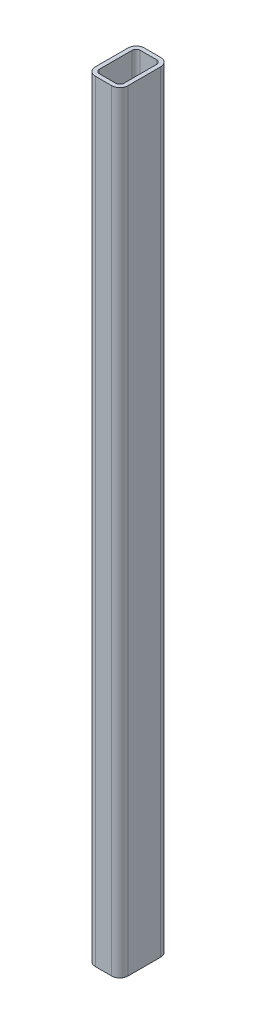
ISO-10303-21;
HEADER;
FILE_DESCRIPTION(('STEP AP214'),'2;1');
FILE_NAME('part.step','',(''),(''),'','','');
FILE_SCHEMA(('AUTOMOTIVE_DESIGN { 1 0 10303 214 1 1 1 1 }'));
ENDSEC;
DATA;
#1=APPLICATION_CONTEXT('core data for automotive mechanical design processes');
#2=APPLICATION_PROTOCOL_DEFINITION('international standard','automotive_design',2000,#1);
#3=PRODUCT_CONTEXT('',#1,'mechanical');
#4=PRODUCT('Part','Part','',(#3));
#5=PRODUCT_RELATED_PRODUCT_CATEGORY('part','',(#4));
#6=PRODUCT_DEFINITION_FORMATION('','',#4);
#7=PRODUCT_DEFINITION_CONTEXT('part definition',#1,'design');
#8=PRODUCT_DEFINITION('design','',#6,#7);
#9=PRODUCT_DEFINITION_SHAPE('','',#8);
#10=(LENGTH_UNIT() NAMED_UNIT(*) SI_UNIT(.MILLI.,.METRE.));
#11=(NAMED_UNIT(*) PLANE_ANGLE_UNIT() SI_UNIT($,.RADIAN.));
#12=(NAMED_UNIT(*) SI_UNIT($,.STERADIAN.) SOLID_ANGLE_UNIT());
#13=UNCERTAINTY_MEASURE_WITH_UNIT(LENGTH_MEASURE(1.E-05),#10,'distance_accuracy_value','');
#14=(GEOMETRIC_REPRESENTATION_CONTEXT(3) GLOBAL_UNCERTAINTY_ASSIGNED_CONTEXT((#13)) GLOBAL_UNIT_ASSIGNED_CONTEXT((#10,
#11,#12)) REPRESENTATION_CONTEXT('',''));
#15=CARTESIAN_POINT('',(0.,0.,0.));
#16=DIRECTION('',(0.,0.,1.));
#17=DIRECTION('',(1.,0.,0.));
#18=AXIS2_PLACEMENT_3D('',#15,#16,#17);
#19=CARTESIAN_POINT('',(-12.699978,1200.,25.4));
#20=DIRECTION('',(0.,-1.,0.));
#21=DIRECTION('',(0.,0.,-1.));
#22=AXIS2_PLACEMENT_3D('',#19,#20,#21);
#23=CYLINDRICAL_SURFACE('',#22,12.7);
#24=CARTESIAN_POINT('',(-12.699978,0.,25.4));
#25=DIRECTION('',(0.,1.,0.));
#26=DIRECTION('',(0.,0.,1.));
#27=AXIS2_PLACEMENT_3D('',#24,#25,#26);
#28=CIRCLE('',#27,12.7);
#29=CARTESIAN_POINT('',(-25.399978,0.,25.4));
#30=VERTEX_POINT('',#29);
#31=CARTESIAN_POINT('',(-12.699978,0.,38.1));
#32=VERTEX_POINT('',#31);
#33=EDGE_CURVE('E234',#30,#32,#28,.T.);
#34=ORIENTED_EDGE('',*,*,#33,.T.);
#35=DIRECTION('',(0.,-1.,0.));
#36=VECTOR('',#35,1.);
#37=CARTESIAN_POINT('',(-12.699978,1200.,38.1));
#38=LINE('',#37,#36);
#39=CARTESIAN_POINT('',(-12.699978,1200.,38.1));
#40=VERTEX_POINT('',#39);
#41=EDGE_CURVE('E12',#40,#32,#38,.T.);
#42=ORIENTED_EDGE('',*,*,#41,.F.);
#43=CARTESIAN_POINT('',(-12.699978,1200.,25.4));
#44=DIRECTION('',(0.,1.,0.));
#45=DIRECTION('',(0.,0.,1.));
#46=AXIS2_PLACEMENT_3D('',#43,#44,#45);
#47=CIRCLE('',#46,12.7);
#48=CARTESIAN_POINT('',(-25.399978,1200.,25.4));
#49=VERTEX_POINT('',#48);
#50=EDGE_CURVE('E312',#49,#40,#47,.T.);
#51=ORIENTED_EDGE('',*,*,#50,.F.);
#52=DIRECTION('',(0.,-1.,0.));
#53=VECTOR('',#52,1.);
#54=CARTESIAN_POINT('',(-25.399978,1200.,25.4));
#55=LINE('',#54,#53);
#56=EDGE_CURVE('E249',#49,#30,#55,.T.);
#57=ORIENTED_EDGE('',*,*,#56,.T.);
#58=EDGE_LOOP('',(#34,#42,#51,#57));
#59=FACE_BOUND('',#58,.T.);
#60=ADVANCED_FACE('F62',(#59),#23,.T.);
#61=CARTESIAN_POINT('',(-12.699978,1200.,38.1));
#62=DIRECTION('',(0.,0.,-1.));
#63=DIRECTION('',(-1.,0.,0.));
#64=AXIS2_PLACEMENT_3D('',#61,#62,#63);
#65=PLANE('',#64);
#66=DIRECTION('',(1.,0.,0.));
#67=VECTOR('',#66,1.);
#68=CARTESIAN_POINT('',(-12.699978,0.,38.1));
#69=LINE('',#68,#67);
#70=CARTESIAN_POINT('',(12.699978,0.,38.1));
#71=VERTEX_POINT('',#70);
#72=EDGE_CURVE('E237',#32,#71,#69,.T.);
#73=ORIENTED_EDGE('',*,*,#72,.T.);
#74=DIRECTION('',(0.,-1.,0.));
#75=VECTOR('',#74,1.);
#76=CARTESIAN_POINT('',(12.699978,1200.,38.1));
#77=LINE('',#76,#75);
#78=CARTESIAN_POINT('',(12.699978,1200.,38.1));
#79=VERTEX_POINT('',#78);
#80=EDGE_CURVE('E72',#79,#71,#77,.T.);
#81=ORIENTED_EDGE('',*,*,#80,.F.);
#82=DIRECTION('',(1.,0.,0.));
#83=VECTOR('',#82,1.);
#84=CARTESIAN_POINT('',(-12.699978,1200.,38.1));
#85=LINE('',#84,#83);
#86=EDGE_CURVE('E314',#40,#79,#85,.T.);
#87=ORIENTED_EDGE('',*,*,#86,.F.);
#88=ORIENTED_EDGE('',*,*,#41,.T.);
#89=EDGE_LOOP('',(#73,#81,#87,#88));
#90=FACE_BOUND('',#89,.T.);
#91=ADVANCED_FACE('F349',(#90),#65,.F.);
#92=CARTESIAN_POINT('',(12.699978,1200.,25.4));
#93=DIRECTION('',(0.,-1.,0.));
#94=DIRECTION('',(0.,0.,-1.));
#95=AXIS2_PLACEMENT_3D('',#92,#93,#94);
#96=CYLINDRICAL_SURFACE('',#95,12.7);
#97=CARTESIAN_POINT('',(12.699978,0.,25.4));
#98=DIRECTION('',(0.,1.,0.));
#99=DIRECTION('',(0.,0.,1.));
#100=AXIS2_PLACEMENT_3D('',#97,#98,#99);
#101=CIRCLE('',#100,12.7);
#102=CARTESIAN_POINT('',(25.399978,0.,25.4));
#103=VERTEX_POINT('',#102);
#104=EDGE_CURVE('E239',#71,#103,#101,.T.);
#105=ORIENTED_EDGE('',*,*,#104,.T.);
#106=DIRECTION('',(0.,-1.,0.));
#107=VECTOR('',#106,1.);
#108=CARTESIAN_POINT('',(25.399978,1200.,25.4));
#109=LINE('',#108,#107);
#110=CARTESIAN_POINT('',(25.399978,1200.,25.4));
#111=VERTEX_POINT('',#110);
#112=EDGE_CURVE('E256',#111,#103,#109,.T.);
#113=ORIENTED_EDGE('',*,*,#112,.F.);
#114=CARTESIAN_POINT('',(12.699978,1200.,25.4));
#115=DIRECTION('',(0.,1.,0.));
#116=DIRECTION('',(0.,0.,1.));
#117=AXIS2_PLACEMENT_3D('',#114,#115,#116);
#118=CIRCLE('',#117,12.7);
#119=EDGE_CURVE('E316',#79,#111,#118,.T.);
#120=ORIENTED_EDGE('',*,*,#119,.F.);
#121=ORIENTED_EDGE('',*,*,#80,.T.);
#122=EDGE_LOOP('',(#105,#113,#120,#121));
#123=FACE_BOUND('',#122,.T.);
#124=ADVANCED_FACE('F354',(#123),#96,.T.);
#125=CARTESIAN_POINT('',(25.399978,1200.,-25.4));
#126=DIRECTION('',(-1.,0.,0.));
#127=DIRECTION('',(0.,0.,1.));
#128=AXIS2_PLACEMENT_3D('',#125,#126,#127);
#129=PLANE('',#128);
#130=DIRECTION('',(0.,0.,-1.));
#131=VECTOR('',#130,1.);
#132=CARTESIAN_POINT('',(25.399978,0.,-25.4));
#133=LINE('',#132,#131);
#134=CARTESIAN_POINT('',(25.399978,0.,-25.4));
#135=VERTEX_POINT('',#134);
#136=EDGE_CURVE('E241',#103,#135,#133,.T.);
#137=ORIENTED_EDGE('',*,*,#136,.T.);
#138=DIRECTION('',(0.,-1.,0.));
#139=VECTOR('',#138,1.);
#140=CARTESIAN_POINT('',(25.399978,1200.,-25.4));
#141=LINE('',#140,#139);
#142=CARTESIAN_POINT('',(25.399978,1200.,-25.4));
#143=VERTEX_POINT('',#142);
#144=EDGE_CURVE('E253',#143,#135,#141,.T.);
#145=ORIENTED_EDGE('',*,*,#144,.F.);
#146=DIRECTION('',(0.,0.,-1.));
#147=VECTOR('',#146,1.);
#148=CARTESIAN_POINT('',(25.399978,1200.,-25.4));
#149=LINE('',#148,#147);
#150=EDGE_CURVE('E318',#111,#143,#149,.T.);
#151=ORIENTED_EDGE('',*,*,#150,.F.);
#152=ORIENTED_EDGE('',*,*,#112,.T.);
#153=EDGE_LOOP('',(#137,#145,#151,#152));
#154=FACE_BOUND('',#153,.T.);
#155=ADVANCED_FACE('F324',(#154),#129,.F.);
#156=CARTESIAN_POINT('',(12.699978,1200.,-25.4));
#157=DIRECTION('',(0.,-1.,0.));
#158=DIRECTION('',(0.,0.,-1.));
#159=AXIS2_PLACEMENT_3D('',#156,#157,#158);
#160=CYLINDRICAL_SURFACE('',#159,12.7);
#161=CARTESIAN_POINT('',(12.699978,0.,-25.4));
#162=DIRECTION('',(0.,1.,0.));
#163=DIRECTION('',(0.,0.,1.));
#164=AXIS2_PLACEMENT_3D('',#161,#162,#163);
#165=CIRCLE('',#164,12.7);
#166=CARTESIAN_POINT('',(12.699978,0.,-38.1));
#167=VERTEX_POINT('',#166);
#168=EDGE_CURVE('E243',#135,#167,#165,.T.);
#169=ORIENTED_EDGE('',*,*,#168,.T.);
#170=DIRECTION('',(0.,-1.,0.));
#171=VECTOR('',#170,1.);
#172=CARTESIAN_POINT('',(12.699978,1200.,-38.1));
#173=LINE('',#172,#171);
#174=CARTESIAN_POINT('',(12.699978,1200.,-38.1));
#175=VERTEX_POINT('',#174);
#176=EDGE_CURVE('E201',#175,#167,#173,.T.);
#177=ORIENTED_EDGE('',*,*,#176,.F.);
#178=CARTESIAN_POINT('',(12.699978,1200.,-25.4));
#179=DIRECTION('',(0.,1.,0.));
#180=DIRECTION('',(0.,0.,1.));
#181=AXIS2_PLACEMENT_3D('',#178,#179,#180);
#182=CIRCLE('',#181,12.7);
#183=EDGE_CURVE('E192',#143,#175,#182,.T.);
#184=ORIENTED_EDGE('',*,*,#183,.F.);
#185=ORIENTED_EDGE('',*,*,#144,.T.);
#186=EDGE_LOOP('',(#169,#177,#184,#185));
#187=FACE_BOUND('',#186,.T.);
#188=ADVANCED_FACE('F328',(#187),#160,.T.);
#189=CARTESIAN_POINT('',(12.699978,1200.,-38.1));
#190=DIRECTION('',(0.,0.,1.));
#191=DIRECTION('',(1.,0.,0.));
#192=AXIS2_PLACEMENT_3D('',#189,#190,#191);
#193=PLANE('',#192);
#194=DIRECTION('',(-1.,0.,0.));
#195=VECTOR('',#194,1.);
#196=CARTESIAN_POINT('',(12.699978,0.,-38.1));
#197=LINE('',#196,#195);
#198=CARTESIAN_POINT('',(-12.699978,0.,-38.1));
#199=VERTEX_POINT('',#198);
#200=EDGE_CURVE('E200',#167,#199,#197,.T.);
#201=ORIENTED_EDGE('',*,*,#200,.T.);
#202=DIRECTION('',(0.,-1.,0.));
#203=VECTOR('',#202,1.);
#204=CARTESIAN_POINT('',(-12.699978,1200.,-38.1));
#205=LINE('',#204,#203);
#206=CARTESIAN_POINT('',(-12.699978,1200.,-38.1));
#207=VERTEX_POINT('',#206);
#208=EDGE_CURVE('E197',#207,#199,#205,.T.);
#209=ORIENTED_EDGE('',*,*,#208,.F.);
#210=DIRECTION('',(-1.,0.,0.));
#211=VECTOR('',#210,1.);
#212=CARTESIAN_POINT('',(12.699978,1200.,-38.1));
#213=LINE('',#212,#211);
#214=EDGE_CURVE('E186',#175,#207,#213,.T.);
#215=ORIENTED_EDGE('',*,*,#214,.F.);
#216=ORIENTED_EDGE('',*,*,#176,.T.);
#217=EDGE_LOOP('',(#201,#209,#215,#216));
#218=FACE_BOUND('',#217,.T.);
#219=ADVANCED_FACE('F198',(#218),#193,.F.);
#220=CARTESIAN_POINT('',(-12.699978,1200.,-25.4));
#221=DIRECTION('',(0.,-1.,0.));
#222=DIRECTION('',(0.,0.,-1.));
#223=AXIS2_PLACEMENT_3D('',#220,#221,#222);
#224=CYLINDRICAL_SURFACE('',#223,12.7);
#225=CARTESIAN_POINT('',(-12.699978,0.,-25.4));
#226=DIRECTION('',(0.,1.,0.));
#227=DIRECTION('',(0.,0.,1.));
#228=AXIS2_PLACEMENT_3D('',#225,#226,#227);
#229=CIRCLE('',#228,12.7);
#230=CARTESIAN_POINT('',(-25.399978,0.,-25.4));
#231=VERTEX_POINT('',#230);
#232=EDGE_CURVE('E134',#199,#231,#229,.T.);
#233=ORIENTED_EDGE('',*,*,#232,.T.);
#234=DIRECTION('',(0.,-1.,0.));
#235=VECTOR('',#234,1.);
#236=CARTESIAN_POINT('',(-25.399978,1200.,-25.4));
#237=LINE('',#236,#235);
#238=CARTESIAN_POINT('',(-25.399978,1200.,-25.4));
#239=VERTEX_POINT('',#238);
#240=EDGE_CURVE('E202',#239,#231,#237,.T.);
#241=ORIENTED_EDGE('',*,*,#240,.F.);
#242=CARTESIAN_POINT('',(-12.699978,1200.,-25.4));
#243=DIRECTION('',(0.,1.,0.));
#244=DIRECTION('',(0.,0.,1.));
#245=AXIS2_PLACEMENT_3D('',#242,#243,#244);
#246=CIRCLE('',#245,12.7);
#247=EDGE_CURVE('E190',#207,#239,#246,.T.);
#248=ORIENTED_EDGE('',*,*,#247,.F.);
#249=ORIENTED_EDGE('',*,*,#208,.T.);
#250=EDGE_LOOP('',(#233,#241,#248,#249));
#251=FACE_BOUND('',#250,.T.);
#252=ADVANCED_FACE('F204',(#251),#224,.T.);
#253=CARTESIAN_POINT('',(12.699978,1200.,25.4));
#254=DIRECTION('',(0.,-1.,0.));
#255=DIRECTION('',(0.,0.,-1.));
#256=AXIS2_PLACEMENT_3D('',#253,#254,#255);
#257=CYLINDRICAL_SURFACE('',#256,6.35);
#258=CARTESIAN_POINT('',(12.699978,0.,25.4));
#259=DIRECTION('',(0.,1.,0.));
#260=DIRECTION('',(0.,0.,1.));
#261=AXIS2_PLACEMENT_3D('',#258,#259,#260);
#262=CIRCLE('',#261,6.35);
#263=CARTESIAN_POINT('',(12.699978,0.,31.75));
#264=VERTEX_POINT('',#263);
#265=CARTESIAN_POINT('',(19.049978,0.,25.4));
#266=VERTEX_POINT('',#265);
#267=EDGE_CURVE('E210',#264,#266,#262,.T.);
#268=ORIENTED_EDGE('',*,*,#267,.F.);
#269=DIRECTION('',(0.,-1.,0.));
#270=VECTOR('',#269,1.);
#271=CARTESIAN_POINT('',(12.699978,1200.,31.75));
#272=LINE('',#271,#270);
#273=CARTESIAN_POINT('',(12.699978,1200.,31.75));
#274=VERTEX_POINT('',#273);
#275=EDGE_CURVE('E66',#274,#264,#272,.T.);
#276=ORIENTED_EDGE('',*,*,#275,.F.);
#277=CARTESIAN_POINT('',(12.699978,1200.,25.4));
#278=DIRECTION('',(0.,1.,0.));
#279=DIRECTION('',(0.,0.,1.));
#280=AXIS2_PLACEMENT_3D('',#277,#278,#279);
#281=CIRCLE('',#280,6.35);
#282=CARTESIAN_POINT('',(19.049978,1200.,25.4));
#283=VERTEX_POINT('',#282);
#284=EDGE_CURVE('E248',#274,#283,#281,.T.);
#285=ORIENTED_EDGE('',*,*,#284,.T.);
#286=DIRECTION('',(0.,-1.,0.));
#287=VECTOR('',#286,1.);
#288=CARTESIAN_POINT('',(19.049978,1200.,25.4));
#289=LINE('',#288,#287);
#290=EDGE_CURVE('E206',#283,#266,#289,.T.);
#291=ORIENTED_EDGE('',*,*,#290,.T.);
#292=EDGE_LOOP('',(#268,#276,#285,#291));
#293=FACE_BOUND('',#292,.T.);
#294=ADVANCED_FACE('F64',(#293),#257,.F.);
#295=CARTESIAN_POINT('',(-12.699978,1200.,31.75));
#296=DIRECTION('',(0.,0.,-1.));
#297=DIRECTION('',(-1.,0.,0.));
#298=AXIS2_PLACEMENT_3D('',#295,#296,#297);
#299=PLANE('',#298);
#300=DIRECTION('',(1.,0.,0.));
#301=VECTOR('',#300,1.);
#302=CARTESIAN_POINT('',(-12.699978,0.,31.75));
#303=LINE('',#302,#301);
#304=CARTESIAN_POINT('',(-12.699978,0.,31.75));
#305=VERTEX_POINT('',#304);
#306=EDGE_CURVE('E213',#305,#264,#303,.T.);
#307=ORIENTED_EDGE('',*,*,#306,.F.);
#308=DIRECTION('',(0.,-1.,0.));
#309=VECTOR('',#308,1.);
#310=CARTESIAN_POINT('',(-12.699978,1200.,31.75));
#311=LINE('',#310,#309);
#312=CARTESIAN_POINT('',(-12.699978,1200.,31.75));
#313=VERTEX_POINT('',#312);
#314=EDGE_CURVE('E271',#313,#305,#311,.T.);
#315=ORIENTED_EDGE('',*,*,#314,.F.);
#316=DIRECTION('',(1.,0.,0.));
#317=VECTOR('',#316,1.);
#318=CARTESIAN_POINT('',(-12.699978,1200.,31.75));
#319=LINE('',#318,#317);
#320=EDGE_CURVE('E280',#313,#274,#319,.T.);
#321=ORIENTED_EDGE('',*,*,#320,.T.);
#322=ORIENTED_EDGE('',*,*,#275,.T.);
#323=EDGE_LOOP('',(#307,#315,#321,#322));
#324=FACE_BOUND('',#323,.T.);
#325=ADVANCED_FACE('F278',(#324),#299,.T.);
#326=CARTESIAN_POINT('',(-12.699978,1200.,25.4));
#327=DIRECTION('',(0.,-1.,0.));
#328=DIRECTION('',(0.,0.,-1.));
#329=AXIS2_PLACEMENT_3D('',#326,#327,#328);
#330=CYLINDRICAL_SURFACE('',#329,6.35);
#331=CARTESIAN_POINT('',(-12.699978,0.,25.4));
#332=DIRECTION('',(0.,1.,0.));
#333=DIRECTION('',(0.,0.,1.));
#334=AXIS2_PLACEMENT_3D('',#331,#332,#333);
#335=CIRCLE('',#334,6.35);
#336=CARTESIAN_POINT('',(-19.049978,0.,25.4));
#337=VERTEX_POINT('',#336);
#338=EDGE_CURVE('E216',#337,#305,#335,.T.);
#339=ORIENTED_EDGE('',*,*,#338,.F.);
#340=DIRECTION('',(0.,-1.,0.));
#341=VECTOR('',#340,1.);
#342=CARTESIAN_POINT('',(-19.049978,1200.,25.4));
#343=LINE('',#342,#341);
#344=CARTESIAN_POINT('',(-19.049978,1200.,25.4));
#345=VERTEX_POINT('',#344);
#346=EDGE_CURVE('E270',#345,#337,#343,.T.);
#347=ORIENTED_EDGE('',*,*,#346,.F.);
#348=CARTESIAN_POINT('',(-12.699978,1200.,25.4));
#349=DIRECTION('',(0.,1.,0.));
#350=DIRECTION('',(0.,0.,1.));
#351=AXIS2_PLACEMENT_3D('',#348,#349,#350);
#352=CIRCLE('',#351,6.35);
#353=EDGE_CURVE('E288',#345,#313,#352,.T.);
#354=ORIENTED_EDGE('',*,*,#353,.T.);
#355=ORIENTED_EDGE('',*,*,#314,.T.);
#356=EDGE_LOOP('',(#339,#347,#354,#355));
#357=FACE_BOUND('',#356,.T.);
#358=ADVANCED_FACE('F286',(#357),#330,.F.);
#359=CARTESIAN_POINT('',(-19.049978,1200.,25.4));
#360=DIRECTION('',(1.,0.,0.));
#361=DIRECTION('',(0.,0.,-1.));
#362=AXIS2_PLACEMENT_3D('',#359,#360,#361);
#363=PLANE('',#362);
#364=DIRECTION('',(0.,0.,1.));
#365=VECTOR('',#364,1.);
#366=CARTESIAN_POINT('',(-19.049978,0.,25.4));
#367=LINE('',#366,#365);
#368=CARTESIAN_POINT('',(-19.049978,0.,-25.4));
#369=VERTEX_POINT('',#368);
#370=EDGE_CURVE('E219',#369,#337,#367,.T.);
#371=ORIENTED_EDGE('',*,*,#370,.F.);
#372=DIRECTION('',(0.,-1.,0.));
#373=VECTOR('',#372,1.);
#374=CARTESIAN_POINT('',(-19.049978,1200.,-25.4));
#375=LINE('',#374,#373);
#376=CARTESIAN_POINT('',(-19.049978,1200.,-25.4));
#377=VERTEX_POINT('',#376);
#378=EDGE_CURVE('E268',#377,#369,#375,.T.);
#379=ORIENTED_EDGE('',*,*,#378,.F.);
#380=DIRECTION('',(0.,0.,1.));
#381=VECTOR('',#380,1.);
#382=CARTESIAN_POINT('',(-19.049978,1200.,25.4));
#383=LINE('',#382,#381);
#384=EDGE_CURVE('E294',#377,#345,#383,.T.);
#385=ORIENTED_EDGE('',*,*,#384,.T.);
#386=ORIENTED_EDGE('',*,*,#346,.T.);
#387=EDGE_LOOP('',(#371,#379,#385,#386));
#388=FACE_BOUND('',#387,.T.);
#389=ADVANCED_FACE('F297',(#388),#363,.T.);
#390=CARTESIAN_POINT('',(-12.699978,1200.,-25.4));
#391=DIRECTION('',(0.,-1.,0.));
#392=DIRECTION('',(0.,0.,-1.));
#393=AXIS2_PLACEMENT_3D('',#390,#391,#392);
#394=CYLINDRICAL_SURFACE('',#393,6.35);
#395=CARTESIAN_POINT('',(-12.699978,0.,-25.4));
#396=DIRECTION('',(0.,1.,0.));
#397=DIRECTION('',(0.,0.,1.));
#398=AXIS2_PLACEMENT_3D('',#395,#396,#397);
#399=CIRCLE('',#398,6.35);
#400=CARTESIAN_POINT('',(-12.699978,0.,-31.75));
#401=VERTEX_POINT('',#400);
#402=EDGE_CURVE('E222',#401,#369,#399,.T.);
#403=ORIENTED_EDGE('',*,*,#402,.F.);
#404=DIRECTION('',(0.,-1.,0.));
#405=VECTOR('',#404,1.);
#406=CARTESIAN_POINT('',(-12.699978,1200.,-31.75));
#407=LINE('',#406,#405);
#408=CARTESIAN_POINT('',(-12.699978,1200.,-31.75));
#409=VERTEX_POINT('',#408);
#410=EDGE_CURVE('E266',#409,#401,#407,.T.);
#411=ORIENTED_EDGE('',*,*,#410,.F.);
#412=CARTESIAN_POINT('',(-12.699978,1200.,-25.4));
#413=DIRECTION('',(0.,1.,0.));
#414=DIRECTION('',(0.,0.,1.));
#415=AXIS2_PLACEMENT_3D('',#412,#413,#414);
#416=CIRCLE('',#415,6.35);
#417=EDGE_CURVE('E298',#409,#377,#416,.T.);
#418=ORIENTED_EDGE('',*,*,#417,.T.);
#419=ORIENTED_EDGE('',*,*,#378,.T.);
#420=EDGE_LOOP('',(#403,#411,#418,#419));
#421=FACE_BOUND('',#420,.T.);
#422=ADVANCED_FACE('F365',(#421),#394,.F.);
#423=CARTESIAN_POINT('',(12.699978,1200.,-31.75));
#424=DIRECTION('',(0.,0.,1.));
#425=DIRECTION('',(1.,0.,0.));
#426=AXIS2_PLACEMENT_3D('',#423,#424,#425);
#427=PLANE('',#426);
#428=DIRECTION('',(-1.,0.,0.));
#429=VECTOR('',#428,1.);
#430=CARTESIAN_POINT('',(12.699978,0.,-31.75));
#431=LINE('',#430,#429);
#432=CARTESIAN_POINT('',(12.699978,0.,-31.75));
#433=VERTEX_POINT('',#432);
#434=EDGE_CURVE('E225',#433,#401,#431,.T.);
#435=ORIENTED_EDGE('',*,*,#434,.F.);
#436=DIRECTION('',(0.,-1.,0.));
#437=VECTOR('',#436,1.);
#438=CARTESIAN_POINT('',(12.699978,1200.,-31.75));
#439=LINE('',#438,#437);
#440=CARTESIAN_POINT('',(12.699978,1200.,-31.75));
#441=VERTEX_POINT('',#440);
#442=EDGE_CURVE('E264',#441,#433,#439,.T.);
#443=ORIENTED_EDGE('',*,*,#442,.F.);
#444=DIRECTION('',(-1.,0.,0.));
#445=VECTOR('',#444,1.);
#446=CARTESIAN_POINT('',(12.699978,1200.,-31.75));
#447=LINE('',#446,#445);
#448=EDGE_CURVE('E300',#441,#409,#447,.T.);
#449=ORIENTED_EDGE('',*,*,#448,.T.);
#450=ORIENTED_EDGE('',*,*,#410,.T.);
#451=EDGE_LOOP('',(#435,#443,#449,#450));
#452=FACE_BOUND('',#451,.T.);
#453=ADVANCED_FACE('F361',(#452),#427,.T.);
#454=CARTESIAN_POINT('',(12.699978,1200.,-25.4));
#455=DIRECTION('',(0.,-1.,0.));
#456=DIRECTION('',(0.,0.,-1.));
#457=AXIS2_PLACEMENT_3D('',#454,#455,#456);
#458=CYLINDRICAL_SURFACE('',#457,6.35);
#459=CARTESIAN_POINT('',(12.699978,0.,-25.4));
#460=DIRECTION('',(0.,1.,0.));
#461=DIRECTION('',(0.,0.,1.));
#462=AXIS2_PLACEMENT_3D('',#459,#460,#461);
#463=CIRCLE('',#462,6.35);
#464=CARTESIAN_POINT('',(19.049978,0.,-25.4));
#465=VERTEX_POINT('',#464);
#466=EDGE_CURVE('E228',#465,#433,#463,.T.);
#467=ORIENTED_EDGE('',*,*,#466,.F.);
#468=DIRECTION('',(0.,-1.,0.));
#469=VECTOR('',#468,1.);
#470=CARTESIAN_POINT('',(19.049978,1200.,-25.4));
#471=LINE('',#470,#469);
#472=CARTESIAN_POINT('',(19.049978,1200.,-25.4));
#473=VERTEX_POINT('',#472);
#474=EDGE_CURVE('E262',#473,#465,#471,.T.);
#475=ORIENTED_EDGE('',*,*,#474,.F.);
#476=CARTESIAN_POINT('',(12.699978,1200.,-25.4));
#477=DIRECTION('',(0.,1.,0.));
#478=DIRECTION('',(0.,0.,1.));
#479=AXIS2_PLACEMENT_3D('',#476,#477,#478);
#480=CIRCLE('',#479,6.35);
#481=EDGE_CURVE('E306',#473,#441,#480,.T.);
#482=ORIENTED_EDGE('',*,*,#481,.T.);
#483=ORIENTED_EDGE('',*,*,#442,.T.);
#484=EDGE_LOOP('',(#467,#475,#482,#483));
#485=FACE_BOUND('',#484,.T.);
#486=ADVANCED_FACE('F343',(#485),#458,.F.);
#487=CARTESIAN_POINT('',(19.049978,1200.,-25.4));
#488=DIRECTION('',(-1.,0.,0.));
#489=DIRECTION('',(0.,0.,1.));
#490=AXIS2_PLACEMENT_3D('',#487,#488,#489);
#491=PLANE('',#490);
#492=DIRECTION('',(0.,0.,-1.));
#493=VECTOR('',#492,1.);
#494=CARTESIAN_POINT('',(19.049978,0.,-25.4));
#495=LINE('',#494,#493);
#496=EDGE_CURVE('E231',#266,#465,#495,.T.);
#497=ORIENTED_EDGE('',*,*,#496,.F.);
#498=ORIENTED_EDGE('',*,*,#290,.F.);
#499=DIRECTION('',(0.,0.,-1.));
#500=VECTOR('',#499,1.);
#501=CARTESIAN_POINT('',(19.049978,1200.,-25.4));
#502=LINE('',#501,#500);
#503=EDGE_CURVE('E309',#283,#473,#502,.T.);
#504=ORIENTED_EDGE('',*,*,#503,.T.);
#505=ORIENTED_EDGE('',*,*,#474,.T.);
#506=EDGE_LOOP('',(#497,#498,#504,#505));
#507=FACE_BOUND('',#506,.T.);
#508=ADVANCED_FACE('F336',(#507),#491,.T.);
#509=CARTESIAN_POINT('',(-25.399978,1200.,25.4));
#510=DIRECTION('',(1.,0.,0.));
#511=DIRECTION('',(0.,0.,-1.));
#512=AXIS2_PLACEMENT_3D('',#509,#510,#511);
#513=PLANE('',#512);
#514=DIRECTION('',(0.,0.,1.));
#515=VECTOR('',#514,1.);
#516=CARTESIAN_POINT('',(-25.399978,0.,25.4));
#517=LINE('',#516,#515);
#518=EDGE_CURVE('E140',#231,#30,#517,.T.);
#519=ORIENTED_EDGE('',*,*,#518,.T.);
#520=ORIENTED_EDGE('',*,*,#56,.F.);
#521=DIRECTION('',(0.,0.,1.));
#522=VECTOR('',#521,1.);
#523=CARTESIAN_POINT('',(-25.399978,1200.,25.4));
#524=LINE('',#523,#522);
#525=EDGE_CURVE('E81',#239,#49,#524,.T.);
#526=ORIENTED_EDGE('',*,*,#525,.F.);
#527=ORIENTED_EDGE('',*,*,#240,.T.);
#528=EDGE_LOOP('',(#519,#520,#526,#527));
#529=FACE_BOUND('',#528,.T.);
#530=ADVANCED_FACE('F334',(#529),#513,.F.);
#531=CARTESIAN_POINT('',(-12.699978,1200.,25.4));
#532=DIRECTION('',(0.,1.,0.));
#533=DIRECTION('',(0.,0.,1.));
#534=AXIS2_PLACEMENT_3D('',#531,#532,#533);
#535=PLANE('',#534);
#536=ORIENTED_EDGE('',*,*,#284,.F.);
#537=ORIENTED_EDGE('',*,*,#320,.F.);
#538=ORIENTED_EDGE('',*,*,#353,.F.);
#539=ORIENTED_EDGE('',*,*,#384,.F.);
#540=ORIENTED_EDGE('',*,*,#417,.F.);
#541=ORIENTED_EDGE('',*,*,#448,.F.);
#542=ORIENTED_EDGE('',*,*,#481,.F.);
#543=ORIENTED_EDGE('',*,*,#503,.F.);
#544=EDGE_LOOP('',(#536,#537,#538,#539,#540,#541,#542,#543));
#545=FACE_BOUND('',#544,.T.);
#546=ORIENTED_EDGE('',*,*,#50,.T.);
#547=ORIENTED_EDGE('',*,*,#86,.T.);
#548=ORIENTED_EDGE('',*,*,#119,.T.);
#549=ORIENTED_EDGE('',*,*,#150,.T.);
#550=ORIENTED_EDGE('',*,*,#183,.T.);
#551=ORIENTED_EDGE('',*,*,#214,.T.);
#552=ORIENTED_EDGE('',*,*,#247,.T.);
#553=ORIENTED_EDGE('',*,*,#525,.T.);
#554=EDGE_LOOP('',(#546,#547,#548,#549,#550,#551,#552,#553));
#555=FACE_BOUND('',#554,.T.);
#556=ADVANCED_FACE('F188',(#545,#555),#535,.T.);
#557=CARTESIAN_POINT('',(-12.699978,0.,25.4));
#558=DIRECTION('',(0.,1.,0.));
#559=DIRECTION('',(0.,0.,1.));
#560=AXIS2_PLACEMENT_3D('',#557,#558,#559);
#561=PLANE('',#560);
#562=ORIENTED_EDGE('',*,*,#267,.T.);
#563=ORIENTED_EDGE('',*,*,#496,.T.);
#564=ORIENTED_EDGE('',*,*,#466,.T.);
#565=ORIENTED_EDGE('',*,*,#434,.T.);
#566=ORIENTED_EDGE('',*,*,#402,.T.);
#567=ORIENTED_EDGE('',*,*,#370,.T.);
#568=ORIENTED_EDGE('',*,*,#338,.T.);
#569=ORIENTED_EDGE('',*,*,#306,.T.);
#570=EDGE_LOOP('',(#562,#563,#564,#565,#566,#567,#568,#569));
#571=FACE_BOUND('',#570,.T.);
#572=ORIENTED_EDGE('',*,*,#33,.F.);
#573=ORIENTED_EDGE('',*,*,#518,.F.);
#574=ORIENTED_EDGE('',*,*,#232,.F.);
#575=ORIENTED_EDGE('',*,*,#200,.F.);
#576=ORIENTED_EDGE('',*,*,#168,.F.);
#577=ORIENTED_EDGE('',*,*,#136,.F.);
#578=ORIENTED_EDGE('',*,*,#104,.F.);
#579=ORIENTED_EDGE('',*,*,#72,.F.);
#580=EDGE_LOOP('',(#572,#573,#574,#575,#576,#577,#578,#579));
#581=FACE_BOUND('',#580,.T.);
#582=ADVANCED_FACE('F283',(#571,#581),#561,.F.);
#583=CLOSED_SHELL('',(#60,#91,#124,#155,#188,#219,#252,#294,#325,#358,#389,#422,#453,#486,#508,
#530,#556,#582));
#584=MANIFOLD_SOLID_BREP('B2',#583);
#585=ADVANCED_BREP_SHAPE_REPRESENTATION('',(#18,#584),#14);
#586=SHAPE_DEFINITION_REPRESENTATION(#9,#585);
ENDSEC;
END-ISO-10303-21;
